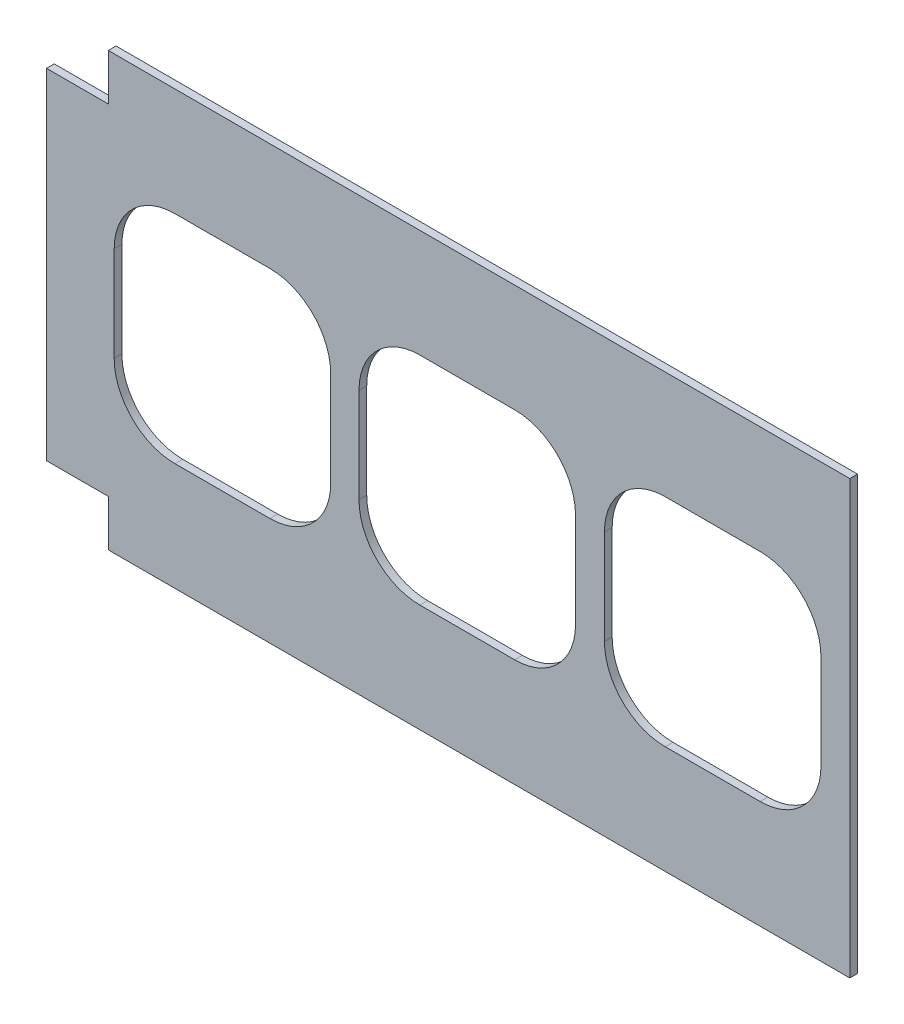
ISO-10303-21;
HEADER;
FILE_DESCRIPTION(('STEP AP214'),'2;1');
FILE_NAME('part.step','',(''),(''),'','','');
FILE_SCHEMA(('AUTOMOTIVE_DESIGN { 1 0 10303 214 1 1 1 1 }'));
ENDSEC;
DATA;
#1=APPLICATION_CONTEXT('core data for automotive mechanical design processes');
#2=APPLICATION_PROTOCOL_DEFINITION('international standard','automotive_design',2000,#1);
#3=PRODUCT_CONTEXT('',#1,'mechanical');
#4=PRODUCT('Part','Part','',(#3));
#5=PRODUCT_RELATED_PRODUCT_CATEGORY('part','',(#4));
#6=PRODUCT_DEFINITION_FORMATION('','',#4);
#7=PRODUCT_DEFINITION_CONTEXT('part definition',#1,'design');
#8=PRODUCT_DEFINITION('design','',#6,#7);
#9=PRODUCT_DEFINITION_SHAPE('','',#8);
#10=(LENGTH_UNIT() NAMED_UNIT(*) SI_UNIT(.MILLI.,.METRE.));
#11=(NAMED_UNIT(*) PLANE_ANGLE_UNIT() SI_UNIT($,.RADIAN.));
#12=(NAMED_UNIT(*) SI_UNIT($,.STERADIAN.) SOLID_ANGLE_UNIT());
#13=UNCERTAINTY_MEASURE_WITH_UNIT(LENGTH_MEASURE(1.E-05),#10,'distance_accuracy_value','');
#14=(GEOMETRIC_REPRESENTATION_CONTEXT(3) GLOBAL_UNCERTAINTY_ASSIGNED_CONTEXT((#13)) GLOBAL_UNIT_ASSIGNED_CONTEXT((#10,
#11,#12)) REPRESENTATION_CONTEXT('',''));
#15=CARTESIAN_POINT('',(0.,0.,0.));
#16=DIRECTION('',(0.,0.,1.));
#17=DIRECTION('',(1.,0.,0.));
#18=AXIS2_PLACEMENT_3D('',#15,#16,#17);
#19=CARTESIAN_POINT('',(0.,0.,3.175));
#20=DIRECTION('',(0.,0.,-1.));
#21=DIRECTION('',(-1.,0.,0.));
#22=AXIS2_PLACEMENT_3D('',#19,#20,#21);
#23=PLANE('',#22);
#24=DIRECTION('',(0.,-1.,0.));
#25=VECTOR('',#24,1.);
#26=CARTESIAN_POINT('',(-149.974,-44.5,3.175));
#27=LINE('',#26,#25);
#28=CARTESIAN_POINT('',(-149.974,19.5,3.175));
#29=VERTEX_POINT('',#28);
#30=CARTESIAN_POINT('',(-149.974,-19.5,3.175));
#31=VERTEX_POINT('',#30);
#32=EDGE_CURVE('E837',#29,#31,#27,.T.);
#33=ORIENTED_EDGE('',*,*,#32,.F.);
#34=CARTESIAN_POINT('',(-124.974,19.5,3.175));
#35=DIRECTION('',(0.,0.,-1.));
#36=DIRECTION('',(-1.,0.,0.));
#37=AXIS2_PLACEMENT_3D('',#34,#35,#36);
#38=CIRCLE('',#37,25.);
#39=CARTESIAN_POINT('',(-124.974,44.5,3.175));
#40=VERTEX_POINT('',#39);
#41=EDGE_CURVE('E333',#29,#40,#38,.T.);
#42=ORIENTED_EDGE('',*,*,#41,.T.);
#43=DIRECTION('',(-1.,0.,0.));
#44=VECTOR('',#43,1.);
#45=CARTESIAN_POINT('',(-60.974,44.5,3.175));
#46=LINE('',#45,#44);
#47=CARTESIAN_POINT('',(-85.974,44.5,3.175));
#48=VERTEX_POINT('',#47);
#49=EDGE_CURVE('E413',#48,#40,#46,.T.);
#50=ORIENTED_EDGE('',*,*,#49,.F.);
#51=CARTESIAN_POINT('',(-85.974,19.5,3.175));
#52=DIRECTION('',(0.,0.,-1.));
#53=DIRECTION('',(-1.,0.,0.));
#54=AXIS2_PLACEMENT_3D('',#51,#52,#53);
#55=CIRCLE('',#54,25.);
#56=CARTESIAN_POINT('',(-60.974,19.5,3.175));
#57=VERTEX_POINT('',#56);
#58=EDGE_CURVE('E345',#48,#57,#55,.T.);
#59=ORIENTED_EDGE('',*,*,#58,.T.);
#60=DIRECTION('',(0.,1.,0.));
#61=VECTOR('',#60,1.);
#62=CARTESIAN_POINT('',(-60.974,-44.5,3.175));
#63=LINE('',#62,#61);
#64=CARTESIAN_POINT('',(-60.974,-19.5,3.175));
#65=VERTEX_POINT('',#64);
#66=EDGE_CURVE('E843',#65,#57,#63,.T.);
#67=ORIENTED_EDGE('',*,*,#66,.F.);
#68=CARTESIAN_POINT('',(-85.974,-19.5,3.175));
#69=DIRECTION('',(0.,0.,-1.));
#70=DIRECTION('',(-1.,0.,0.));
#71=AXIS2_PLACEMENT_3D('',#68,#69,#70);
#72=CIRCLE('',#71,25.);
#73=CARTESIAN_POINT('',(-85.974,-44.5,3.175));
#74=VERTEX_POINT('',#73);
#75=EDGE_CURVE('E341',#65,#74,#72,.T.);
#76=ORIENTED_EDGE('',*,*,#75,.T.);
#77=DIRECTION('',(1.,0.,0.));
#78=VECTOR('',#77,1.);
#79=CARTESIAN_POINT('',(-60.974,-44.5,3.175));
#80=LINE('',#79,#78);
#81=CARTESIAN_POINT('',(-124.974,-44.5,3.175));
#82=VERTEX_POINT('',#81);
#83=EDGE_CURVE('E840',#82,#74,#80,.T.);
#84=ORIENTED_EDGE('',*,*,#83,.F.);
#85=CARTESIAN_POINT('',(-124.974,-19.5,3.175));
#86=DIRECTION('',(0.,0.,-1.));
#87=DIRECTION('',(-1.,0.,0.));
#88=AXIS2_PLACEMENT_3D('',#85,#86,#87);
#89=CIRCLE('',#88,25.);
#90=EDGE_CURVE('E337',#82,#31,#89,.T.);
#91=ORIENTED_EDGE('',*,*,#90,.T.);
#92=EDGE_LOOP('',(#33,#42,#50,#59,#67,#76,#84,#91));
#93=FACE_BOUND('',#92,.T.);
#94=DIRECTION('',(0.,1.,0.));
#95=VECTOR('',#94,1.);
#96=CARTESIAN_POINT('',(152.4,-88.9,3.175));
#97=LINE('',#96,#95);
#98=CARTESIAN_POINT('',(152.4,-88.9,3.175));
#99=VERTEX_POINT('',#98);
#100=CARTESIAN_POINT('',(152.4,88.9,3.175));
#101=VERTEX_POINT('',#100);
#102=EDGE_CURVE('E254',#99,#101,#97,.T.);
#103=ORIENTED_EDGE('',*,*,#102,.T.);
#104=DIRECTION('',(-1.,0.,0.));
#105=VECTOR('',#104,1.);
#106=CARTESIAN_POINT('',(-152.4,88.9,3.175));
#107=LINE('',#106,#105);
#108=CARTESIAN_POINT('',(-152.4,88.9,3.175));
#109=VERTEX_POINT('',#108);
#110=EDGE_CURVE('E243',#101,#109,#107,.T.);
#111=ORIENTED_EDGE('',*,*,#110,.T.);
#112=DIRECTION('',(0.,-1.,0.));
#113=VECTOR('',#112,1.);
#114=CARTESIAN_POINT('',(-152.4,69.85,3.175));
#115=LINE('',#114,#113);
#116=CARTESIAN_POINT('',(-152.4,69.85,3.175));
#117=VERTEX_POINT('',#116);
#118=EDGE_CURVE('E253',#109,#117,#115,.T.);
#119=ORIENTED_EDGE('',*,*,#118,.T.);
#120=DIRECTION('',(-1.,0.,0.));
#121=VECTOR('',#120,1.);
#122=CARTESIAN_POINT('',(-152.4,69.85,3.175));
#123=LINE('',#122,#121);
#124=CARTESIAN_POINT('',(-177.8,69.85,3.175));
#125=VERTEX_POINT('',#124);
#126=EDGE_CURVE('E417',#117,#125,#123,.T.);
#127=ORIENTED_EDGE('',*,*,#126,.T.);
#128=DIRECTION('',(0.,-1.,0.));
#129=VECTOR('',#128,1.);
#130=CARTESIAN_POINT('',(-177.8,69.85,3.175));
#131=LINE('',#130,#129);
#132=CARTESIAN_POINT('',(-177.8,-69.85,3.175));
#133=VERTEX_POINT('',#132);
#134=EDGE_CURVE('E419',#125,#133,#131,.T.);
#135=ORIENTED_EDGE('',*,*,#134,.T.);
#136=DIRECTION('',(1.,0.,0.));
#137=VECTOR('',#136,1.);
#138=CARTESIAN_POINT('',(-177.8,-69.85,3.175));
#139=LINE('',#138,#137);
#140=CARTESIAN_POINT('',(-152.4,-69.85,3.175));
#141=VERTEX_POINT('',#140);
#142=EDGE_CURVE('E421',#133,#141,#139,.T.);
#143=ORIENTED_EDGE('',*,*,#142,.T.);
#144=DIRECTION('',(0.,-1.,0.));
#145=VECTOR('',#144,1.);
#146=CARTESIAN_POINT('',(-152.4,-88.9,3.175));
#147=LINE('',#146,#145);
#148=CARTESIAN_POINT('',(-152.4,-88.9,3.175));
#149=VERTEX_POINT('',#148);
#150=EDGE_CURVE('E423',#141,#149,#147,.T.);
#151=ORIENTED_EDGE('',*,*,#150,.T.);
#152=DIRECTION('',(1.,0.,0.));
#153=VECTOR('',#152,1.);
#154=CARTESIAN_POINT('',(-152.4,-88.9,3.175));
#155=LINE('',#154,#153);
#156=EDGE_CURVE('E258',#149,#99,#155,.T.);
#157=ORIENTED_EDGE('',*,*,#156,.T.);
#158=EDGE_LOOP('',(#103,#111,#119,#127,#135,#143,#151,#157));
#159=FACE_BOUND('',#158,.T.);
#160=DIRECTION('',(0.,1.,0.));
#161=VECTOR('',#160,1.);
#162=CARTESIAN_POINT('',(140.55,-44.5,3.175));
#163=LINE('',#162,#161);
#164=CARTESIAN_POINT('',(140.55,-19.5,3.175));
#165=VERTEX_POINT('',#164);
#166=CARTESIAN_POINT('',(140.55,19.5,3.175));
#167=VERTEX_POINT('',#166);
#168=EDGE_CURVE('E392',#165,#167,#163,.T.);
#169=ORIENTED_EDGE('',*,*,#168,.F.);
#170=CARTESIAN_POINT('',(115.55,-19.5,3.175));
#171=DIRECTION('',(0.,0.,-1.));
#172=DIRECTION('',(-1.,0.,0.));
#173=AXIS2_PLACEMENT_3D('',#170,#171,#172);
#174=CIRCLE('',#173,25.);
#175=CARTESIAN_POINT('',(115.55,-44.5,3.175));
#176=VERTEX_POINT('',#175);
#177=EDGE_CURVE('E365',#165,#176,#174,.T.);
#178=ORIENTED_EDGE('',*,*,#177,.T.);
#179=DIRECTION('',(1.,0.,0.));
#180=VECTOR('',#179,1.);
#181=CARTESIAN_POINT('',(51.55,-44.5,3.175));
#182=LINE('',#181,#180);
#183=CARTESIAN_POINT('',(76.55,-44.5,3.175));
#184=VERTEX_POINT('',#183);
#185=EDGE_CURVE('E410',#184,#176,#182,.T.);
#186=ORIENTED_EDGE('',*,*,#185,.F.);
#187=CARTESIAN_POINT('',(76.55,-19.5,3.175));
#188=DIRECTION('',(0.,0.,-1.));
#189=DIRECTION('',(-1.,0.,0.));
#190=AXIS2_PLACEMENT_3D('',#187,#188,#189);
#191=CIRCLE('',#190,25.);
#192=CARTESIAN_POINT('',(51.55,-19.5,3.175));
#193=VERTEX_POINT('',#192);
#194=EDGE_CURVE('E369',#184,#193,#191,.T.);
#195=ORIENTED_EDGE('',*,*,#194,.T.);
#196=DIRECTION('',(0.,-1.,0.));
#197=VECTOR('',#196,1.);
#198=CARTESIAN_POINT('',(51.55,-44.5,3.175));
#199=LINE('',#198,#197);
#200=CARTESIAN_POINT('',(51.55,19.5,3.175));
#201=VERTEX_POINT('',#200);
#202=EDGE_CURVE('E400',#201,#193,#199,.T.);
#203=ORIENTED_EDGE('',*,*,#202,.F.);
#204=CARTESIAN_POINT('',(76.55,19.5,3.175));
#205=DIRECTION('',(0.,0.,-1.));
#206=DIRECTION('',(-1.,0.,0.));
#207=AXIS2_PLACEMENT_3D('',#204,#205,#206);
#208=CIRCLE('',#207,25.);
#209=CARTESIAN_POINT('',(76.55,44.5,3.175));
#210=VERTEX_POINT('',#209);
#211=EDGE_CURVE('E48',#201,#210,#208,.T.);
#212=ORIENTED_EDGE('',*,*,#211,.T.);
#213=DIRECTION('',(-1.,0.,0.));
#214=VECTOR('',#213,1.);
#215=CARTESIAN_POINT('',(51.55,44.5,3.175));
#216=LINE('',#215,#214);
#217=CARTESIAN_POINT('',(115.55,44.5,3.175));
#218=VERTEX_POINT('',#217);
#219=EDGE_CURVE('E394',#218,#210,#216,.T.);
#220=ORIENTED_EDGE('',*,*,#219,.F.);
#221=CARTESIAN_POINT('',(115.55,19.5,3.175));
#222=DIRECTION('',(0.,0.,-1.));
#223=DIRECTION('',(-1.,0.,0.));
#224=AXIS2_PLACEMENT_3D('',#221,#222,#223);
#225=CIRCLE('',#224,25.);
#226=EDGE_CURVE('E11',#218,#167,#225,.T.);
#227=ORIENTED_EDGE('',*,*,#226,.T.);
#228=EDGE_LOOP('',(#169,#178,#186,#195,#203,#212,#220,#227));
#229=FACE_BOUND('',#228,.T.);
#230=DIRECTION('',(0.,-1.,0.));
#231=VECTOR('',#230,1.);
#232=CARTESIAN_POINT('',(-49.339,-44.5,3.175));
#233=LINE('',#232,#231);
#234=CARTESIAN_POINT('',(-49.339,19.5,3.175));
#235=VERTEX_POINT('',#234);
#236=CARTESIAN_POINT('',(-49.339,-19.5,3.175));
#237=VERTEX_POINT('',#236);
#238=EDGE_CURVE('E809',#235,#237,#233,.T.);
#239=ORIENTED_EDGE('',*,*,#238,.F.);
#240=CARTESIAN_POINT('',(-24.339,19.5,3.175));
#241=DIRECTION('',(0.,0.,-1.));
#242=DIRECTION('',(-1.,0.,0.));
#243=AXIS2_PLACEMENT_3D('',#240,#241,#242);
#244=CIRCLE('',#243,25.);
#245=CARTESIAN_POINT('',(-24.339,44.5,3.175));
#246=VERTEX_POINT('',#245);
#247=EDGE_CURVE('E349',#235,#246,#244,.T.);
#248=ORIENTED_EDGE('',*,*,#247,.T.);
#249=DIRECTION('',(-1.,0.,0.));
#250=VECTOR('',#249,1.);
#251=CARTESIAN_POINT('',(39.661,44.5,3.175));
#252=LINE('',#251,#250);
#253=CARTESIAN_POINT('',(14.661,44.5,3.175));
#254=VERTEX_POINT('',#253);
#255=EDGE_CURVE('E826',#254,#246,#252,.T.);
#256=ORIENTED_EDGE('',*,*,#255,.F.);
#257=CARTESIAN_POINT('',(14.661,19.5,3.175));
#258=DIRECTION('',(0.,0.,-1.));
#259=DIRECTION('',(-1.,0.,0.));
#260=AXIS2_PLACEMENT_3D('',#257,#258,#259);
#261=CIRCLE('',#260,25.);
#262=CARTESIAN_POINT('',(39.661,19.5,3.175));
#263=VERTEX_POINT('',#262);
#264=EDGE_CURVE('E353',#254,#263,#261,.T.);
#265=ORIENTED_EDGE('',*,*,#264,.T.);
#266=DIRECTION('',(0.,1.,0.));
#267=VECTOR('',#266,1.);
#268=CARTESIAN_POINT('',(39.661,-44.5,3.175));
#269=LINE('',#268,#267);
#270=CARTESIAN_POINT('',(39.661,-19.5,3.175));
#271=VERTEX_POINT('',#270);
#272=EDGE_CURVE('E818',#271,#263,#269,.T.);
#273=ORIENTED_EDGE('',*,*,#272,.F.);
#274=CARTESIAN_POINT('',(14.661,-19.5,3.175));
#275=DIRECTION('',(0.,0.,-1.));
#276=DIRECTION('',(-1.,0.,0.));
#277=AXIS2_PLACEMENT_3D('',#274,#275,#276);
#278=CIRCLE('',#277,25.);
#279=CARTESIAN_POINT('',(14.661,-44.5,3.175));
#280=VERTEX_POINT('',#279);
#281=EDGE_CURVE('E357',#271,#280,#278,.T.);
#282=ORIENTED_EDGE('',*,*,#281,.T.);
#283=DIRECTION('',(1.,0.,0.));
#284=VECTOR('',#283,1.);
#285=CARTESIAN_POINT('',(39.661,-44.5,3.175));
#286=LINE('',#285,#284);
#287=CARTESIAN_POINT('',(-24.339,-44.5,3.175));
#288=VERTEX_POINT('',#287);
#289=EDGE_CURVE('E812',#288,#280,#286,.T.);
#290=ORIENTED_EDGE('',*,*,#289,.F.);
#291=CARTESIAN_POINT('',(-24.339,-19.5,3.175));
#292=DIRECTION('',(0.,0.,-1.));
#293=DIRECTION('',(-1.,0.,0.));
#294=AXIS2_PLACEMENT_3D('',#291,#292,#293);
#295=CIRCLE('',#294,25.);
#296=EDGE_CURVE('E361',#288,#237,#295,.T.);
#297=ORIENTED_EDGE('',*,*,#296,.T.);
#298=EDGE_LOOP('',(#239,#248,#256,#265,#273,#282,#290,#297));
#299=FACE_BOUND('',#298,.T.);
#300=ADVANCED_FACE('F33',(#93,#159,#229,#299),#23,.F.);
#301=CARTESIAN_POINT('',(0.,0.,0.));
#302=DIRECTION('',(0.,0.,-1.));
#303=DIRECTION('',(-1.,0.,0.));
#304=AXIS2_PLACEMENT_3D('',#301,#302,#303);
#305=PLANE('',#304);
#306=DIRECTION('',(0.,1.,0.));
#307=VECTOR('',#306,1.);
#308=CARTESIAN_POINT('',(152.4,-88.9,0.));
#309=LINE('',#308,#307);
#310=CARTESIAN_POINT('',(152.4,-88.9,0.));
#311=VERTEX_POINT('',#310);
#312=CARTESIAN_POINT('',(152.4,88.9,0.));
#313=VERTEX_POINT('',#312);
#314=EDGE_CURVE('E266',#311,#313,#309,.T.);
#315=ORIENTED_EDGE('',*,*,#314,.F.);
#316=DIRECTION('',(1.,0.,0.));
#317=VECTOR('',#316,1.);
#318=CARTESIAN_POINT('',(-152.4,-88.9,0.));
#319=LINE('',#318,#317);
#320=CARTESIAN_POINT('',(-152.4,-88.9,0.));
#321=VERTEX_POINT('',#320);
#322=EDGE_CURVE('E262',#321,#311,#319,.T.);
#323=ORIENTED_EDGE('',*,*,#322,.F.);
#324=DIRECTION('',(0.,-1.,0.));
#325=VECTOR('',#324,1.);
#326=CARTESIAN_POINT('',(-152.4,-88.9,0.));
#327=LINE('',#326,#325);
#328=CARTESIAN_POINT('',(-152.4,-69.85,0.));
#329=VERTEX_POINT('',#328);
#330=EDGE_CURVE('E438',#329,#321,#327,.T.);
#331=ORIENTED_EDGE('',*,*,#330,.F.);
#332=DIRECTION('',(1.,0.,0.));
#333=VECTOR('',#332,1.);
#334=CARTESIAN_POINT('',(-177.8,-69.85,0.));
#335=LINE('',#334,#333);
#336=CARTESIAN_POINT('',(-177.8,-69.85,0.));
#337=VERTEX_POINT('',#336);
#338=EDGE_CURVE('E436',#337,#329,#335,.T.);
#339=ORIENTED_EDGE('',*,*,#338,.F.);
#340=DIRECTION('',(0.,-1.,0.));
#341=VECTOR('',#340,1.);
#342=CARTESIAN_POINT('',(-177.8,69.85,0.));
#343=LINE('',#342,#341);
#344=CARTESIAN_POINT('',(-177.8,69.85,0.));
#345=VERTEX_POINT('',#344);
#346=EDGE_CURVE('E434',#345,#337,#343,.T.);
#347=ORIENTED_EDGE('',*,*,#346,.F.);
#348=DIRECTION('',(-1.,0.,0.));
#349=VECTOR('',#348,1.);
#350=CARTESIAN_POINT('',(-152.4,69.85,0.));
#351=LINE('',#350,#349);
#352=CARTESIAN_POINT('',(-152.4,69.85,0.));
#353=VERTEX_POINT('',#352);
#354=EDGE_CURVE('E432',#353,#345,#351,.T.);
#355=ORIENTED_EDGE('',*,*,#354,.F.);
#356=DIRECTION('',(0.,-1.,0.));
#357=VECTOR('',#356,1.);
#358=CARTESIAN_POINT('',(-152.4,69.85,0.));
#359=LINE('',#358,#357);
#360=CARTESIAN_POINT('',(-152.4,88.9,0.));
#361=VERTEX_POINT('',#360);
#362=EDGE_CURVE('E430',#361,#353,#359,.T.);
#363=ORIENTED_EDGE('',*,*,#362,.F.);
#364=DIRECTION('',(-1.,0.,0.));
#365=VECTOR('',#364,1.);
#366=CARTESIAN_POINT('',(-152.4,88.9,0.));
#367=LINE('',#366,#365);
#368=EDGE_CURVE('E428',#313,#361,#367,.T.);
#369=ORIENTED_EDGE('',*,*,#368,.F.);
#370=EDGE_LOOP('',(#315,#323,#331,#339,#347,#355,#363,#369));
#371=FACE_BOUND('',#370,.T.);
#372=DIRECTION('',(0.,-1.,0.));
#373=VECTOR('',#372,1.);
#374=CARTESIAN_POINT('',(51.55,-44.5,0.));
#375=LINE('',#374,#373);
#376=CARTESIAN_POINT('',(51.55,19.5,0.));
#377=VERTEX_POINT('',#376);
#378=CARTESIAN_POINT('',(51.55,-19.5,0.));
#379=VERTEX_POINT('',#378);
#380=EDGE_CURVE('E386',#377,#379,#375,.T.);
#381=ORIENTED_EDGE('',*,*,#380,.T.);
#382=CARTESIAN_POINT('',(76.55,-19.5,0.));
#383=DIRECTION('',(0.,0.,-1.));
#384=DIRECTION('',(-1.,0.,0.));
#385=AXIS2_PLACEMENT_3D('',#382,#383,#384);
#386=CIRCLE('',#385,25.);
#387=CARTESIAN_POINT('',(76.55,-44.5,0.));
#388=VERTEX_POINT('',#387);
#389=EDGE_CURVE('E367',#379,#388,#386,.F.);
#390=ORIENTED_EDGE('',*,*,#389,.T.);
#391=DIRECTION('',(1.,0.,0.));
#392=VECTOR('',#391,1.);
#393=CARTESIAN_POINT('',(51.55,-44.5,0.));
#394=LINE('',#393,#392);
#395=CARTESIAN_POINT('',(115.55,-44.5,0.));
#396=VERTEX_POINT('',#395);
#397=EDGE_CURVE('E398',#388,#396,#394,.T.);
#398=ORIENTED_EDGE('',*,*,#397,.T.);
#399=CARTESIAN_POINT('',(115.55,-19.5,0.));
#400=DIRECTION('',(0.,0.,-1.));
#401=DIRECTION('',(-1.,0.,0.));
#402=AXIS2_PLACEMENT_3D('',#399,#400,#401);
#403=CIRCLE('',#402,25.);
#404=CARTESIAN_POINT('',(140.55,-19.5,0.));
#405=VERTEX_POINT('',#404);
#406=EDGE_CURVE('E363',#396,#405,#403,.F.);
#407=ORIENTED_EDGE('',*,*,#406,.T.);
#408=DIRECTION('',(0.,1.,0.));
#409=VECTOR('',#408,1.);
#410=CARTESIAN_POINT('',(140.55,-44.5,0.));
#411=LINE('',#410,#409);
#412=CARTESIAN_POINT('',(140.55,19.5,0.));
#413=VERTEX_POINT('',#412);
#414=EDGE_CURVE('E381',#405,#413,#411,.T.);
#415=ORIENTED_EDGE('',*,*,#414,.T.);
#416=CARTESIAN_POINT('',(115.55,19.5,0.));
#417=DIRECTION('',(0.,0.,-1.));
#418=DIRECTION('',(-1.,0.,0.));
#419=AXIS2_PLACEMENT_3D('',#416,#417,#418);
#420=CIRCLE('',#419,25.);
#421=CARTESIAN_POINT('',(115.55,44.5,0.));
#422=VERTEX_POINT('',#421);
#423=EDGE_CURVE('E41',#413,#422,#420,.F.);
#424=ORIENTED_EDGE('',*,*,#423,.T.);
#425=DIRECTION('',(-1.,0.,0.));
#426=VECTOR('',#425,1.);
#427=CARTESIAN_POINT('',(51.55,44.5,0.));
#428=LINE('',#427,#426);
#429=CARTESIAN_POINT('',(76.55,44.5,0.));
#430=VERTEX_POINT('',#429);
#431=EDGE_CURVE('E379',#422,#430,#428,.T.);
#432=ORIENTED_EDGE('',*,*,#431,.T.);
#433=CARTESIAN_POINT('',(76.55,19.5,0.));
#434=DIRECTION('',(0.,0.,-1.));
#435=DIRECTION('',(-1.,0.,0.));
#436=AXIS2_PLACEMENT_3D('',#433,#434,#435);
#437=CIRCLE('',#436,25.);
#438=EDGE_CURVE('E371',#430,#377,#437,.F.);
#439=ORIENTED_EDGE('',*,*,#438,.T.);
#440=EDGE_LOOP('',(#381,#390,#398,#407,#415,#424,#432,#439));
#441=FACE_BOUND('',#440,.T.);
#442=DIRECTION('',(0.,1.,0.));
#443=VECTOR('',#442,1.);
#444=CARTESIAN_POINT('',(-60.974,-44.5,0.));
#445=LINE('',#444,#443);
#446=CARTESIAN_POINT('',(-60.974,-19.5,0.));
#447=VERTEX_POINT('',#446);
#448=CARTESIAN_POINT('',(-60.974,19.5,0.));
#449=VERTEX_POINT('',#448);
#450=EDGE_CURVE('E852',#447,#449,#445,.T.);
#451=ORIENTED_EDGE('',*,*,#450,.T.);
#452=CARTESIAN_POINT('',(-85.974,19.5,0.));
#453=DIRECTION('',(0.,0.,-1.));
#454=DIRECTION('',(-1.,0.,0.));
#455=AXIS2_PLACEMENT_3D('',#452,#453,#454);
#456=CIRCLE('',#455,25.);
#457=CARTESIAN_POINT('',(-85.974,44.5,0.));
#458=VERTEX_POINT('',#457);
#459=EDGE_CURVE('E343',#449,#458,#456,.F.);
#460=ORIENTED_EDGE('',*,*,#459,.T.);
#461=DIRECTION('',(-1.,0.,0.));
#462=VECTOR('',#461,1.);
#463=CARTESIAN_POINT('',(-60.974,44.5,0.));
#464=LINE('',#463,#462);
#465=CARTESIAN_POINT('',(-124.974,44.5,0.));
#466=VERTEX_POINT('',#465);
#467=EDGE_CURVE('E405',#458,#466,#464,.T.);
#468=ORIENTED_EDGE('',*,*,#467,.T.);
#469=CARTESIAN_POINT('',(-124.974,19.5,0.));
#470=DIRECTION('',(0.,0.,-1.));
#471=DIRECTION('',(-1.,0.,0.));
#472=AXIS2_PLACEMENT_3D('',#469,#470,#471);
#473=CIRCLE('',#472,25.);
#474=CARTESIAN_POINT('',(-149.974,19.5,0.));
#475=VERTEX_POINT('',#474);
#476=EDGE_CURVE('E331',#466,#475,#473,.F.);
#477=ORIENTED_EDGE('',*,*,#476,.T.);
#478=DIRECTION('',(0.,-1.,0.));
#479=VECTOR('',#478,1.);
#480=CARTESIAN_POINT('',(-149.974,-44.5,0.));
#481=LINE('',#480,#479);
#482=CARTESIAN_POINT('',(-149.974,-19.5,0.));
#483=VERTEX_POINT('',#482);
#484=EDGE_CURVE('E829',#475,#483,#481,.T.);
#485=ORIENTED_EDGE('',*,*,#484,.T.);
#486=CARTESIAN_POINT('',(-124.974,-19.5,0.));
#487=DIRECTION('',(0.,0.,-1.));
#488=DIRECTION('',(-1.,0.,0.));
#489=AXIS2_PLACEMENT_3D('',#486,#487,#488);
#490=CIRCLE('',#489,25.);
#491=CARTESIAN_POINT('',(-124.974,-44.5,0.));
#492=VERTEX_POINT('',#491);
#493=EDGE_CURVE('E335',#483,#492,#490,.F.);
#494=ORIENTED_EDGE('',*,*,#493,.T.);
#495=DIRECTION('',(1.,0.,0.));
#496=VECTOR('',#495,1.);
#497=CARTESIAN_POINT('',(-60.974,-44.5,0.));
#498=LINE('',#497,#496);
#499=CARTESIAN_POINT('',(-85.974,-44.5,0.));
#500=VERTEX_POINT('',#499);
#501=EDGE_CURVE('E850',#492,#500,#498,.T.);
#502=ORIENTED_EDGE('',*,*,#501,.T.);
#503=CARTESIAN_POINT('',(-85.974,-19.5,0.));
#504=DIRECTION('',(0.,0.,-1.));
#505=DIRECTION('',(-1.,0.,0.));
#506=AXIS2_PLACEMENT_3D('',#503,#504,#505);
#507=CIRCLE('',#506,25.);
#508=EDGE_CURVE('E339',#500,#447,#507,.F.);
#509=ORIENTED_EDGE('',*,*,#508,.T.);
#510=EDGE_LOOP('',(#451,#460,#468,#477,#485,#494,#502,#509));
#511=FACE_BOUND('',#510,.T.);
#512=DIRECTION('',(0.,1.,0.));
#513=VECTOR('',#512,1.);
#514=CARTESIAN_POINT('',(39.661,-44.5,0.));
#515=LINE('',#514,#513);
#516=CARTESIAN_POINT('',(39.661,-19.5,0.));
#517=VERTEX_POINT('',#516);
#518=CARTESIAN_POINT('',(39.661,19.5,0.));
#519=VERTEX_POINT('',#518);
#520=EDGE_CURVE('E821',#517,#519,#515,.T.);
#521=ORIENTED_EDGE('',*,*,#520,.T.);
#522=CARTESIAN_POINT('',(14.661,19.5,0.));
#523=DIRECTION('',(0.,0.,-1.));
#524=DIRECTION('',(-1.,0.,0.));
#525=AXIS2_PLACEMENT_3D('',#522,#523,#524);
#526=CIRCLE('',#525,25.);
#527=CARTESIAN_POINT('',(14.661,44.5,0.));
#528=VERTEX_POINT('',#527);
#529=EDGE_CURVE('E351',#519,#528,#526,.F.);
#530=ORIENTED_EDGE('',*,*,#529,.T.);
#531=DIRECTION('',(-1.,0.,0.));
#532=VECTOR('',#531,1.);
#533=CARTESIAN_POINT('',(39.661,44.5,0.));
#534=LINE('',#533,#532);
#535=CARTESIAN_POINT('',(-24.339,44.5,0.));
#536=VERTEX_POINT('',#535);
#537=EDGE_CURVE('E816',#528,#536,#534,.T.);
#538=ORIENTED_EDGE('',*,*,#537,.T.);
#539=CARTESIAN_POINT('',(-24.339,19.5,0.));
#540=DIRECTION('',(0.,0.,-1.));
#541=DIRECTION('',(-1.,0.,0.));
#542=AXIS2_PLACEMENT_3D('',#539,#540,#541);
#543=CIRCLE('',#542,25.);
#544=CARTESIAN_POINT('',(-49.339,19.5,0.));
#545=VERTEX_POINT('',#544);
#546=EDGE_CURVE('E347',#536,#545,#543,.F.);
#547=ORIENTED_EDGE('',*,*,#546,.T.);
#548=DIRECTION('',(0.,-1.,0.));
#549=VECTOR('',#548,1.);
#550=CARTESIAN_POINT('',(-49.339,-44.5,0.));
#551=LINE('',#550,#549);
#552=CARTESIAN_POINT('',(-49.339,-19.5,0.));
#553=VERTEX_POINT('',#552);
#554=EDGE_CURVE('E830',#545,#553,#551,.T.);
#555=ORIENTED_EDGE('',*,*,#554,.T.);
#556=CARTESIAN_POINT('',(-24.339,-19.5,0.));
#557=DIRECTION('',(0.,0.,-1.));
#558=DIRECTION('',(-1.,0.,0.));
#559=AXIS2_PLACEMENT_3D('',#556,#557,#558);
#560=CIRCLE('',#559,25.);
#561=CARTESIAN_POINT('',(-24.339,-44.5,0.));
#562=VERTEX_POINT('',#561);
#563=EDGE_CURVE('E359',#553,#562,#560,.F.);
#564=ORIENTED_EDGE('',*,*,#563,.T.);
#565=DIRECTION('',(1.,0.,0.));
#566=VECTOR('',#565,1.);
#567=CARTESIAN_POINT('',(39.661,-44.5,0.));
#568=LINE('',#567,#566);
#569=CARTESIAN_POINT('',(14.661,-44.5,0.));
#570=VERTEX_POINT('',#569);
#571=EDGE_CURVE('E832',#562,#570,#568,.T.);
#572=ORIENTED_EDGE('',*,*,#571,.T.);
#573=CARTESIAN_POINT('',(14.661,-19.5,0.));
#574=DIRECTION('',(0.,0.,-1.));
#575=DIRECTION('',(-1.,0.,0.));
#576=AXIS2_PLACEMENT_3D('',#573,#574,#575);
#577=CIRCLE('',#576,25.);
#578=EDGE_CURVE('E355',#570,#517,#577,.F.);
#579=ORIENTED_EDGE('',*,*,#578,.T.);
#580=EDGE_LOOP('',(#521,#530,#538,#547,#555,#564,#572,#579));
#581=FACE_BOUND('',#580,.T.);
#582=ADVANCED_FACE('F377',(#371,#441,#511,#581),#305,.T.);
#583=CARTESIAN_POINT('',(152.4,-88.9,3.175));
#584=DIRECTION('',(-1.,0.,0.));
#585=DIRECTION('',(0.,0.,1.));
#586=AXIS2_PLACEMENT_3D('',#583,#584,#585);
#587=PLANE('',#586);
#588=ORIENTED_EDGE('',*,*,#314,.T.);
#589=DIRECTION('',(0.,0.,-1.));
#590=VECTOR('',#589,1.);
#591=CARTESIAN_POINT('',(152.4,88.9,3.175));
#592=LINE('',#591,#590);
#593=EDGE_CURVE('E247',#101,#313,#592,.T.);
#594=ORIENTED_EDGE('',*,*,#593,.F.);
#595=ORIENTED_EDGE('',*,*,#102,.F.);
#596=DIRECTION('',(0.,0.,-1.));
#597=VECTOR('',#596,1.);
#598=CARTESIAN_POINT('',(152.4,-88.9,3.175));
#599=LINE('',#598,#597);
#600=EDGE_CURVE('E426',#99,#311,#599,.T.);
#601=ORIENTED_EDGE('',*,*,#600,.T.);
#602=EDGE_LOOP('',(#588,#594,#595,#601));
#603=FACE_BOUND('',#602,.T.);
#604=ADVANCED_FACE('F264',(#603),#587,.F.);
#605=CARTESIAN_POINT('',(-152.4,88.9,3.175));
#606=DIRECTION('',(0.,-1.,0.));
#607=DIRECTION('',(0.,0.,-1.));
#608=AXIS2_PLACEMENT_3D('',#605,#606,#607);
#609=PLANE('',#608);
#610=ORIENTED_EDGE('',*,*,#368,.T.);
#611=DIRECTION('',(0.,0.,-1.));
#612=VECTOR('',#611,1.);
#613=CARTESIAN_POINT('',(-152.4,88.9,3.175));
#614=LINE('',#613,#612);
#615=EDGE_CURVE('E250',#109,#361,#614,.T.);
#616=ORIENTED_EDGE('',*,*,#615,.F.);
#617=ORIENTED_EDGE('',*,*,#110,.F.);
#618=ORIENTED_EDGE('',*,*,#593,.T.);
#619=EDGE_LOOP('',(#610,#616,#617,#618));
#620=FACE_BOUND('',#619,.T.);
#621=ADVANCED_FACE('F245',(#620),#609,.F.);
#622=CARTESIAN_POINT('',(-152.4,69.85,3.175));
#623=DIRECTION('',(1.,0.,0.));
#624=DIRECTION('',(0.,0.,-1.));
#625=AXIS2_PLACEMENT_3D('',#622,#623,#624);
#626=PLANE('',#625);
#627=ORIENTED_EDGE('',*,*,#362,.T.);
#628=DIRECTION('',(0.,0.,-1.));
#629=VECTOR('',#628,1.);
#630=CARTESIAN_POINT('',(-152.4,69.85,3.175));
#631=LINE('',#630,#629);
#632=EDGE_CURVE('E271',#117,#353,#631,.T.);
#633=ORIENTED_EDGE('',*,*,#632,.F.);
#634=ORIENTED_EDGE('',*,*,#118,.F.);
#635=ORIENTED_EDGE('',*,*,#615,.T.);
#636=EDGE_LOOP('',(#627,#633,#634,#635));
#637=FACE_BOUND('',#636,.T.);
#638=ADVANCED_FACE('F476',(#637),#626,.F.);
#639=CARTESIAN_POINT('',(-152.4,69.85,3.175));
#640=DIRECTION('',(0.,-1.,0.));
#641=DIRECTION('',(0.,0.,-1.));
#642=AXIS2_PLACEMENT_3D('',#639,#640,#641);
#643=PLANE('',#642);
#644=ORIENTED_EDGE('',*,*,#354,.T.);
#645=DIRECTION('',(0.,0.,-1.));
#646=VECTOR('',#645,1.);
#647=CARTESIAN_POINT('',(-177.8,69.85,3.175));
#648=LINE('',#647,#646);
#649=EDGE_CURVE('E451',#125,#345,#648,.T.);
#650=ORIENTED_EDGE('',*,*,#649,.F.);
#651=ORIENTED_EDGE('',*,*,#126,.F.);
#652=ORIENTED_EDGE('',*,*,#632,.T.);
#653=EDGE_LOOP('',(#644,#650,#651,#652));
#654=FACE_BOUND('',#653,.T.);
#655=ADVANCED_FACE('F458',(#654),#643,.F.);
#656=CARTESIAN_POINT('',(-177.8,69.85,3.175));
#657=DIRECTION('',(1.,0.,0.));
#658=DIRECTION('',(0.,0.,-1.));
#659=AXIS2_PLACEMENT_3D('',#656,#657,#658);
#660=PLANE('',#659);
#661=ORIENTED_EDGE('',*,*,#346,.T.);
#662=DIRECTION('',(0.,0.,-1.));
#663=VECTOR('',#662,1.);
#664=CARTESIAN_POINT('',(-177.8,-69.85,3.175));
#665=LINE('',#664,#663);
#666=EDGE_CURVE('E448',#133,#337,#665,.T.);
#667=ORIENTED_EDGE('',*,*,#666,.F.);
#668=ORIENTED_EDGE('',*,*,#134,.F.);
#669=ORIENTED_EDGE('',*,*,#649,.T.);
#670=EDGE_LOOP('',(#661,#667,#668,#669));
#671=FACE_BOUND('',#670,.T.);
#672=ADVANCED_FACE('F468',(#671),#660,.F.);
#673=CARTESIAN_POINT('',(-177.8,-69.85,3.175));
#674=DIRECTION('',(0.,1.,0.));
#675=DIRECTION('',(0.,0.,1.));
#676=AXIS2_PLACEMENT_3D('',#673,#674,#675);
#677=PLANE('',#676);
#678=ORIENTED_EDGE('',*,*,#338,.T.);
#679=DIRECTION('',(0.,0.,-1.));
#680=VECTOR('',#679,1.);
#681=CARTESIAN_POINT('',(-152.4,-69.85,3.175));
#682=LINE('',#681,#680);
#683=EDGE_CURVE('E445',#141,#329,#682,.T.);
#684=ORIENTED_EDGE('',*,*,#683,.F.);
#685=ORIENTED_EDGE('',*,*,#142,.F.);
#686=ORIENTED_EDGE('',*,*,#666,.T.);
#687=EDGE_LOOP('',(#678,#684,#685,#686));
#688=FACE_BOUND('',#687,.T.);
#689=ADVANCED_FACE('F472',(#688),#677,.F.);
#690=CARTESIAN_POINT('',(-152.4,-88.9,3.175));
#691=DIRECTION('',(1.,0.,0.));
#692=DIRECTION('',(0.,0.,-1.));
#693=AXIS2_PLACEMENT_3D('',#690,#691,#692);
#694=PLANE('',#693);
#695=ORIENTED_EDGE('',*,*,#330,.T.);
#696=DIRECTION('',(0.,0.,-1.));
#697=VECTOR('',#696,1.);
#698=CARTESIAN_POINT('',(-152.4,-88.9,3.175));
#699=LINE('',#698,#697);
#700=EDGE_CURVE('E442',#149,#321,#699,.T.);
#701=ORIENTED_EDGE('',*,*,#700,.F.);
#702=ORIENTED_EDGE('',*,*,#150,.F.);
#703=ORIENTED_EDGE('',*,*,#683,.T.);
#704=EDGE_LOOP('',(#695,#701,#702,#703));
#705=FACE_BOUND('',#704,.T.);
#706=ADVANCED_FACE('F499',(#705),#694,.F.);
#707=CARTESIAN_POINT('',(-152.4,-88.9,3.175));
#708=DIRECTION('',(0.,1.,0.));
#709=DIRECTION('',(0.,0.,1.));
#710=AXIS2_PLACEMENT_3D('',#707,#708,#709);
#711=PLANE('',#710);
#712=ORIENTED_EDGE('',*,*,#322,.T.);
#713=ORIENTED_EDGE('',*,*,#600,.F.);
#714=ORIENTED_EDGE('',*,*,#156,.F.);
#715=ORIENTED_EDGE('',*,*,#700,.T.);
#716=EDGE_LOOP('',(#712,#713,#714,#715));
#717=FACE_BOUND('',#716,.T.);
#718=ADVANCED_FACE('F496',(#717),#711,.F.);
#719=CARTESIAN_POINT('',(140.55,-44.5,3.175));
#720=DIRECTION('',(-1.,0.,0.));
#721=DIRECTION('',(0.,0.,1.));
#722=AXIS2_PLACEMENT_3D('',#719,#720,#721);
#723=PLANE('',#722);
#724=ORIENTED_EDGE('',*,*,#414,.F.);
#725=DIRECTION('',(0.,0.,-1.));
#726=VECTOR('',#725,1.);
#727=CARTESIAN_POINT('',(140.55,-19.5,3.175));
#728=LINE('',#727,#726);
#729=EDGE_CURVE('E320',#405,#165,#728,.F.);
#730=ORIENTED_EDGE('',*,*,#729,.T.);
#731=ORIENTED_EDGE('',*,*,#168,.T.);
#732=DIRECTION('',(0.,0.,-1.));
#733=VECTOR('',#732,1.);
#734=CARTESIAN_POINT('',(140.55,19.5,0.));
#735=LINE('',#734,#733);
#736=EDGE_CURVE('E317',#167,#413,#735,.T.);
#737=ORIENTED_EDGE('',*,*,#736,.T.);
#738=EDGE_LOOP('',(#724,#730,#731,#737));
#739=FACE_BOUND('',#738,.T.);
#740=ADVANCED_FACE('F396',(#739),#723,.T.);
#741=CARTESIAN_POINT('',(51.55,44.5,3.175));
#742=DIRECTION('',(0.,-1.,0.));
#743=DIRECTION('',(0.,0.,-1.));
#744=AXIS2_PLACEMENT_3D('',#741,#742,#743);
#745=PLANE('',#744);
#746=ORIENTED_EDGE('',*,*,#219,.T.);
#747=DIRECTION('',(0.,0.,-1.));
#748=VECTOR('',#747,1.);
#749=CARTESIAN_POINT('',(76.55,44.5,0.));
#750=LINE('',#749,#748);
#751=EDGE_CURVE('E328',#210,#430,#750,.T.);
#752=ORIENTED_EDGE('',*,*,#751,.T.);
#753=ORIENTED_EDGE('',*,*,#431,.F.);
#754=DIRECTION('',(0.,0.,-1.));
#755=VECTOR('',#754,1.);
#756=CARTESIAN_POINT('',(115.55,44.5,3.175));
#757=LINE('',#756,#755);
#758=EDGE_CURVE('E55',#422,#218,#757,.F.);
#759=ORIENTED_EDGE('',*,*,#758,.T.);
#760=EDGE_LOOP('',(#746,#752,#753,#759));
#761=FACE_BOUND('',#760,.T.);
#762=ADVANCED_FACE('F384',(#761),#745,.T.);
#763=CARTESIAN_POINT('',(51.55,-44.5,3.175));
#764=DIRECTION('',(1.,0.,0.));
#765=DIRECTION('',(0.,0.,-1.));
#766=AXIS2_PLACEMENT_3D('',#763,#764,#765);
#767=PLANE('',#766);
#768=ORIENTED_EDGE('',*,*,#202,.T.);
#769=DIRECTION('',(0.,0.,-1.));
#770=VECTOR('',#769,1.);
#771=CARTESIAN_POINT('',(51.55,-19.5,0.));
#772=LINE('',#771,#770);
#773=EDGE_CURVE('E324',#193,#379,#772,.T.);
#774=ORIENTED_EDGE('',*,*,#773,.T.);
#775=ORIENTED_EDGE('',*,*,#380,.F.);
#776=DIRECTION('',(0.,0.,-1.));
#777=VECTOR('',#776,1.);
#778=CARTESIAN_POINT('',(51.55,19.5,3.175));
#779=LINE('',#778,#777);
#780=EDGE_CURVE('E322',#377,#201,#779,.F.);
#781=ORIENTED_EDGE('',*,*,#780,.T.);
#782=EDGE_LOOP('',(#768,#774,#775,#781));
#783=FACE_BOUND('',#782,.T.);
#784=ADVANCED_FACE('F535',(#783),#767,.T.);
#785=CARTESIAN_POINT('',(51.55,-44.5,3.175));
#786=DIRECTION('',(0.,1.,0.));
#787=DIRECTION('',(0.,0.,1.));
#788=AXIS2_PLACEMENT_3D('',#785,#786,#787);
#789=PLANE('',#788);
#790=ORIENTED_EDGE('',*,*,#185,.T.);
#791=DIRECTION('',(0.,0.,-1.));
#792=VECTOR('',#791,1.);
#793=CARTESIAN_POINT('',(115.55,-44.5,0.));
#794=LINE('',#793,#792);
#795=EDGE_CURVE('E314',#176,#396,#794,.T.);
#796=ORIENTED_EDGE('',*,*,#795,.T.);
#797=ORIENTED_EDGE('',*,*,#397,.F.);
#798=DIRECTION('',(0.,0.,-1.));
#799=VECTOR('',#798,1.);
#800=CARTESIAN_POINT('',(76.55,-44.5,3.175));
#801=LINE('',#800,#799);
#802=EDGE_CURVE('E312',#388,#184,#801,.F.);
#803=ORIENTED_EDGE('',*,*,#802,.T.);
#804=EDGE_LOOP('',(#790,#796,#797,#803));
#805=FACE_BOUND('',#804,.T.);
#806=ADVANCED_FACE('F541',(#805),#789,.T.);
#807=CARTESIAN_POINT('',(-149.974,-44.5,3.175));
#808=DIRECTION('',(1.,0.,0.));
#809=DIRECTION('',(0.,0.,-1.));
#810=AXIS2_PLACEMENT_3D('',#807,#808,#809);
#811=PLANE('',#810);
#812=ORIENTED_EDGE('',*,*,#484,.F.);
#813=DIRECTION('',(0.,0.,-1.));
#814=VECTOR('',#813,1.);
#815=CARTESIAN_POINT('',(-149.974,19.5,3.175));
#816=LINE('',#815,#814);
#817=EDGE_CURVE('E280',#475,#29,#816,.F.);
#818=ORIENTED_EDGE('',*,*,#817,.T.);
#819=ORIENTED_EDGE('',*,*,#32,.T.);
#820=DIRECTION('',(0.,0.,-1.));
#821=VECTOR('',#820,1.);
#822=CARTESIAN_POINT('',(-149.974,-19.5,0.));
#823=LINE('',#822,#821);
#824=EDGE_CURVE('E277',#31,#483,#823,.T.);
#825=ORIENTED_EDGE('',*,*,#824,.T.);
#826=EDGE_LOOP('',(#812,#818,#819,#825));
#827=FACE_BOUND('',#826,.T.);
#828=ADVANCED_FACE('F549',(#827),#811,.T.);
#829=CARTESIAN_POINT('',(-60.974,-44.5,3.175));
#830=DIRECTION('',(0.,1.,0.));
#831=DIRECTION('',(-1.,0.,0.));
#832=AXIS2_PLACEMENT_3D('',#829,#830,#831);
#833=PLANE('',#832);
#834=ORIENTED_EDGE('',*,*,#501,.F.);
#835=DIRECTION('',(0.,0.,-1.));
#836=VECTOR('',#835,1.);
#837=CARTESIAN_POINT('',(-124.974,-44.5,3.175));
#838=LINE('',#837,#836);
#839=EDGE_CURVE('E285',#492,#82,#838,.F.);
#840=ORIENTED_EDGE('',*,*,#839,.T.);
#841=ORIENTED_EDGE('',*,*,#83,.T.);
#842=DIRECTION('',(0.,0.,-1.));
#843=VECTOR('',#842,1.);
#844=CARTESIAN_POINT('',(-85.974,-44.5,0.));
#845=LINE('',#844,#843);
#846=EDGE_CURVE('E282',#74,#500,#845,.T.);
#847=ORIENTED_EDGE('',*,*,#846,.T.);
#848=EDGE_LOOP('',(#834,#840,#841,#847));
#849=FACE_BOUND('',#848,.T.);
#850=ADVANCED_FACE('F557',(#849),#833,.T.);
#851=CARTESIAN_POINT('',(-60.974,-44.5,3.175));
#852=DIRECTION('',(-1.,0.,0.));
#853=DIRECTION('',(0.,0.,1.));
#854=AXIS2_PLACEMENT_3D('',#851,#852,#853);
#855=PLANE('',#854);
#856=ORIENTED_EDGE('',*,*,#450,.F.);
#857=DIRECTION('',(0.,0.,-1.));
#858=VECTOR('',#857,1.);
#859=CARTESIAN_POINT('',(-60.974,-19.5,3.175));
#860=LINE('',#859,#858);
#861=EDGE_CURVE('E290',#447,#65,#860,.F.);
#862=ORIENTED_EDGE('',*,*,#861,.T.);
#863=ORIENTED_EDGE('',*,*,#66,.T.);
#864=DIRECTION('',(0.,0.,-1.));
#865=VECTOR('',#864,1.);
#866=CARTESIAN_POINT('',(-60.974,19.5,0.));
#867=LINE('',#866,#865);
#868=EDGE_CURVE('E287',#57,#449,#867,.T.);
#869=ORIENTED_EDGE('',*,*,#868,.T.);
#870=EDGE_LOOP('',(#856,#862,#863,#869));
#871=FACE_BOUND('',#870,.T.);
#872=ADVANCED_FACE('F565',(#871),#855,.T.);
#873=CARTESIAN_POINT('',(-60.974,44.5,3.175));
#874=DIRECTION('',(0.,-1.,0.));
#875=DIRECTION('',(1.,0.,0.));
#876=AXIS2_PLACEMENT_3D('',#873,#874,#875);
#877=PLANE('',#876);
#878=ORIENTED_EDGE('',*,*,#49,.T.);
#879=DIRECTION('',(0.,0.,-1.));
#880=VECTOR('',#879,1.);
#881=CARTESIAN_POINT('',(-124.974,44.5,0.));
#882=LINE('',#881,#880);
#883=EDGE_CURVE('E269',#40,#466,#882,.T.);
#884=ORIENTED_EDGE('',*,*,#883,.T.);
#885=ORIENTED_EDGE('',*,*,#467,.F.);
#886=DIRECTION('',(0.,0.,-1.));
#887=VECTOR('',#886,1.);
#888=CARTESIAN_POINT('',(-85.974,44.5,3.175));
#889=LINE('',#888,#887);
#890=EDGE_CURVE('E267',#458,#48,#889,.F.);
#891=ORIENTED_EDGE('',*,*,#890,.T.);
#892=EDGE_LOOP('',(#878,#884,#885,#891));
#893=FACE_BOUND('',#892,.T.);
#894=ADVANCED_FACE('F573',(#893),#877,.T.);
#895=CARTESIAN_POINT('',(-49.339,-44.5,3.175));
#896=DIRECTION('',(1.,0.,0.));
#897=DIRECTION('',(0.,0.,-1.));
#898=AXIS2_PLACEMENT_3D('',#895,#896,#897);
#899=PLANE('',#898);
#900=ORIENTED_EDGE('',*,*,#554,.F.);
#901=DIRECTION('',(0.,0.,-1.));
#902=VECTOR('',#901,1.);
#903=CARTESIAN_POINT('',(-49.339,19.5,3.175));
#904=LINE('',#903,#902);
#905=EDGE_CURVE('E300',#545,#235,#904,.F.);
#906=ORIENTED_EDGE('',*,*,#905,.T.);
#907=ORIENTED_EDGE('',*,*,#238,.T.);
#908=DIRECTION('',(0.,0.,-1.));
#909=VECTOR('',#908,1.);
#910=CARTESIAN_POINT('',(-49.339,-19.5,0.));
#911=LINE('',#910,#909);
#912=EDGE_CURVE('E297',#237,#553,#911,.T.);
#913=ORIENTED_EDGE('',*,*,#912,.T.);
#914=EDGE_LOOP('',(#900,#906,#907,#913));
#915=FACE_BOUND('',#914,.T.);
#916=ADVANCED_FACE('F581',(#915),#899,.T.);
#917=CARTESIAN_POINT('',(39.661,-44.5,3.175));
#918=DIRECTION('',(0.,1.,0.));
#919=DIRECTION('',(-1.,0.,0.));
#920=AXIS2_PLACEMENT_3D('',#917,#918,#919);
#921=PLANE('',#920);
#922=ORIENTED_EDGE('',*,*,#289,.T.);
#923=DIRECTION('',(0.,0.,-1.));
#924=VECTOR('',#923,1.);
#925=CARTESIAN_POINT('',(14.661,-44.5,0.));
#926=LINE('',#925,#924);
#927=EDGE_CURVE('E309',#280,#570,#926,.T.);
#928=ORIENTED_EDGE('',*,*,#927,.T.);
#929=ORIENTED_EDGE('',*,*,#571,.F.);
#930=DIRECTION('',(0.,0.,-1.));
#931=VECTOR('',#930,1.);
#932=CARTESIAN_POINT('',(-24.339,-44.5,3.175));
#933=LINE('',#932,#931);
#934=EDGE_CURVE('E307',#562,#288,#933,.F.);
#935=ORIENTED_EDGE('',*,*,#934,.T.);
#936=EDGE_LOOP('',(#922,#928,#929,#935));
#937=FACE_BOUND('',#936,.T.);
#938=ADVANCED_FACE('F589',(#937),#921,.T.);
#939=CARTESIAN_POINT('',(39.661,-44.5,3.175));
#940=DIRECTION('',(-1.,0.,0.));
#941=DIRECTION('',(0.,0.,1.));
#942=AXIS2_PLACEMENT_3D('',#939,#940,#941);
#943=PLANE('',#942);
#944=ORIENTED_EDGE('',*,*,#272,.T.);
#945=DIRECTION('',(0.,0.,-1.));
#946=VECTOR('',#945,1.);
#947=CARTESIAN_POINT('',(39.661,19.5,0.));
#948=LINE('',#947,#946);
#949=EDGE_CURVE('E304',#263,#519,#948,.T.);
#950=ORIENTED_EDGE('',*,*,#949,.T.);
#951=ORIENTED_EDGE('',*,*,#520,.F.);
#952=DIRECTION('',(0.,0.,-1.));
#953=VECTOR('',#952,1.);
#954=CARTESIAN_POINT('',(39.661,-19.5,3.175));
#955=LINE('',#954,#953);
#956=EDGE_CURVE('E302',#517,#271,#955,.F.);
#957=ORIENTED_EDGE('',*,*,#956,.T.);
#958=EDGE_LOOP('',(#944,#950,#951,#957));
#959=FACE_BOUND('',#958,.T.);
#960=ADVANCED_FACE('F597',(#959),#943,.T.);
#961=CARTESIAN_POINT('',(39.661,44.5,3.175));
#962=DIRECTION('',(0.,-1.,0.));
#963=DIRECTION('',(1.,0.,0.));
#964=AXIS2_PLACEMENT_3D('',#961,#962,#963);
#965=PLANE('',#964);
#966=ORIENTED_EDGE('',*,*,#255,.T.);
#967=DIRECTION('',(0.,0.,-1.));
#968=VECTOR('',#967,1.);
#969=CARTESIAN_POINT('',(-24.339,44.5,0.));
#970=LINE('',#969,#968);
#971=EDGE_CURVE('E294',#246,#536,#970,.T.);
#972=ORIENTED_EDGE('',*,*,#971,.T.);
#973=ORIENTED_EDGE('',*,*,#537,.F.);
#974=DIRECTION('',(0.,0.,-1.));
#975=VECTOR('',#974,1.);
#976=CARTESIAN_POINT('',(14.661,44.5,3.175));
#977=LINE('',#976,#975);
#978=EDGE_CURVE('E292',#528,#254,#977,.F.);
#979=ORIENTED_EDGE('',*,*,#978,.T.);
#980=EDGE_LOOP('',(#966,#972,#973,#979));
#981=FACE_BOUND('',#980,.T.);
#982=ADVANCED_FACE('F605',(#981),#965,.T.);
#983=CARTESIAN_POINT('',(-124.974,19.5,3.175));
#984=DIRECTION('',(0.,0.,1.));
#985=DIRECTION('',(1.,0.,0.));
#986=AXIS2_PLACEMENT_3D('',#983,#984,#985);
#987=CYLINDRICAL_SURFACE('',#986,25.);
#988=ORIENTED_EDGE('',*,*,#41,.F.);
#989=ORIENTED_EDGE('',*,*,#817,.F.);
#990=ORIENTED_EDGE('',*,*,#476,.F.);
#991=ORIENTED_EDGE('',*,*,#883,.F.);
#992=EDGE_LOOP('',(#988,#989,#990,#991));
#993=FACE_BOUND('',#992,.T.);
#994=ADVANCED_FACE('F613',(#993),#987,.F.);
#995=CARTESIAN_POINT('',(-124.974,-19.5,3.175));
#996=DIRECTION('',(0.,0.,1.));
#997=DIRECTION('',(1.,0.,0.));
#998=AXIS2_PLACEMENT_3D('',#995,#996,#997);
#999=CYLINDRICAL_SURFACE('',#998,25.);
#1000=ORIENTED_EDGE('',*,*,#90,.F.);
#1001=ORIENTED_EDGE('',*,*,#839,.F.);
#1002=ORIENTED_EDGE('',*,*,#493,.F.);
#1003=ORIENTED_EDGE('',*,*,#824,.F.);
#1004=EDGE_LOOP('',(#1000,#1001,#1002,#1003));
#1005=FACE_BOUND('',#1004,.T.);
#1006=ADVANCED_FACE('F621',(#1005),#999,.F.);
#1007=CARTESIAN_POINT('',(-85.974,-19.5,3.175));
#1008=DIRECTION('',(0.,0.,1.));
#1009=DIRECTION('',(1.,0.,0.));
#1010=AXIS2_PLACEMENT_3D('',#1007,#1008,#1009);
#1011=CYLINDRICAL_SURFACE('',#1010,25.);
#1012=ORIENTED_EDGE('',*,*,#75,.F.);
#1013=ORIENTED_EDGE('',*,*,#861,.F.);
#1014=ORIENTED_EDGE('',*,*,#508,.F.);
#1015=ORIENTED_EDGE('',*,*,#846,.F.);
#1016=EDGE_LOOP('',(#1012,#1013,#1014,#1015));
#1017=FACE_BOUND('',#1016,.T.);
#1018=ADVANCED_FACE('F629',(#1017),#1011,.F.);
#1019=CARTESIAN_POINT('',(-85.974,19.5,3.175));
#1020=DIRECTION('',(0.,0.,1.));
#1021=DIRECTION('',(1.,0.,0.));
#1022=AXIS2_PLACEMENT_3D('',#1019,#1020,#1021);
#1023=CYLINDRICAL_SURFACE('',#1022,25.);
#1024=ORIENTED_EDGE('',*,*,#58,.F.);
#1025=ORIENTED_EDGE('',*,*,#890,.F.);
#1026=ORIENTED_EDGE('',*,*,#459,.F.);
#1027=ORIENTED_EDGE('',*,*,#868,.F.);
#1028=EDGE_LOOP('',(#1024,#1025,#1026,#1027));
#1029=FACE_BOUND('',#1028,.T.);
#1030=ADVANCED_FACE('F637',(#1029),#1023,.F.);
#1031=CARTESIAN_POINT('',(-24.339,19.5,3.175));
#1032=DIRECTION('',(0.,0.,1.));
#1033=DIRECTION('',(1.,0.,0.));
#1034=AXIS2_PLACEMENT_3D('',#1031,#1032,#1033);
#1035=CYLINDRICAL_SURFACE('',#1034,25.);
#1036=ORIENTED_EDGE('',*,*,#247,.F.);
#1037=ORIENTED_EDGE('',*,*,#905,.F.);
#1038=ORIENTED_EDGE('',*,*,#546,.F.);
#1039=ORIENTED_EDGE('',*,*,#971,.F.);
#1040=EDGE_LOOP('',(#1036,#1037,#1038,#1039));
#1041=FACE_BOUND('',#1040,.T.);
#1042=ADVANCED_FACE('F645',(#1041),#1035,.F.);
#1043=CARTESIAN_POINT('',(14.661,19.5,3.175));
#1044=DIRECTION('',(0.,0.,1.));
#1045=DIRECTION('',(1.,0.,0.));
#1046=AXIS2_PLACEMENT_3D('',#1043,#1044,#1045);
#1047=CYLINDRICAL_SURFACE('',#1046,25.);
#1048=ORIENTED_EDGE('',*,*,#264,.F.);
#1049=ORIENTED_EDGE('',*,*,#978,.F.);
#1050=ORIENTED_EDGE('',*,*,#529,.F.);
#1051=ORIENTED_EDGE('',*,*,#949,.F.);
#1052=EDGE_LOOP('',(#1048,#1049,#1050,#1051));
#1053=FACE_BOUND('',#1052,.T.);
#1054=ADVANCED_FACE('F653',(#1053),#1047,.F.);
#1055=CARTESIAN_POINT('',(14.661,-19.5,3.175));
#1056=DIRECTION('',(0.,0.,1.));
#1057=DIRECTION('',(1.,0.,0.));
#1058=AXIS2_PLACEMENT_3D('',#1055,#1056,#1057);
#1059=CYLINDRICAL_SURFACE('',#1058,25.);
#1060=ORIENTED_EDGE('',*,*,#281,.F.);
#1061=ORIENTED_EDGE('',*,*,#956,.F.);
#1062=ORIENTED_EDGE('',*,*,#578,.F.);
#1063=ORIENTED_EDGE('',*,*,#927,.F.);
#1064=EDGE_LOOP('',(#1060,#1061,#1062,#1063));
#1065=FACE_BOUND('',#1064,.T.);
#1066=ADVANCED_FACE('F661',(#1065),#1059,.F.);
#1067=CARTESIAN_POINT('',(-24.339,-19.5,3.175));
#1068=DIRECTION('',(0.,0.,1.));
#1069=DIRECTION('',(1.,0.,0.));
#1070=AXIS2_PLACEMENT_3D('',#1067,#1068,#1069);
#1071=CYLINDRICAL_SURFACE('',#1070,25.);
#1072=ORIENTED_EDGE('',*,*,#296,.F.);
#1073=ORIENTED_EDGE('',*,*,#934,.F.);
#1074=ORIENTED_EDGE('',*,*,#563,.F.);
#1075=ORIENTED_EDGE('',*,*,#912,.F.);
#1076=EDGE_LOOP('',(#1072,#1073,#1074,#1075));
#1077=FACE_BOUND('',#1076,.T.);
#1078=ADVANCED_FACE('F669',(#1077),#1071,.F.);
#1079=CARTESIAN_POINT('',(115.55,-19.5,3.175));
#1080=DIRECTION('',(0.,0.,1.));
#1081=DIRECTION('',(1.,0.,0.));
#1082=AXIS2_PLACEMENT_3D('',#1079,#1080,#1081);
#1083=CYLINDRICAL_SURFACE('',#1082,25.);
#1084=ORIENTED_EDGE('',*,*,#177,.F.);
#1085=ORIENTED_EDGE('',*,*,#729,.F.);
#1086=ORIENTED_EDGE('',*,*,#406,.F.);
#1087=ORIENTED_EDGE('',*,*,#795,.F.);
#1088=EDGE_LOOP('',(#1084,#1085,#1086,#1087));
#1089=FACE_BOUND('',#1088,.T.);
#1090=ADVANCED_FACE('F677',(#1089),#1083,.F.);
#1091=CARTESIAN_POINT('',(76.55,-19.5,3.175));
#1092=DIRECTION('',(0.,0.,1.));
#1093=DIRECTION('',(1.,0.,0.));
#1094=AXIS2_PLACEMENT_3D('',#1091,#1092,#1093);
#1095=CYLINDRICAL_SURFACE('',#1094,25.);
#1096=ORIENTED_EDGE('',*,*,#194,.F.);
#1097=ORIENTED_EDGE('',*,*,#802,.F.);
#1098=ORIENTED_EDGE('',*,*,#389,.F.);
#1099=ORIENTED_EDGE('',*,*,#773,.F.);
#1100=EDGE_LOOP('',(#1096,#1097,#1098,#1099));
#1101=FACE_BOUND('',#1100,.T.);
#1102=ADVANCED_FACE('F685',(#1101),#1095,.F.);
#1103=CARTESIAN_POINT('',(76.55,19.5,3.175));
#1104=DIRECTION('',(0.,0.,1.));
#1105=DIRECTION('',(1.,0.,0.));
#1106=AXIS2_PLACEMENT_3D('',#1103,#1104,#1105);
#1107=CYLINDRICAL_SURFACE('',#1106,25.);
#1108=ORIENTED_EDGE('',*,*,#211,.F.);
#1109=ORIENTED_EDGE('',*,*,#780,.F.);
#1110=ORIENTED_EDGE('',*,*,#438,.F.);
#1111=ORIENTED_EDGE('',*,*,#751,.F.);
#1112=EDGE_LOOP('',(#1108,#1109,#1110,#1111));
#1113=FACE_BOUND('',#1112,.T.);
#1114=ADVANCED_FACE('F693',(#1113),#1107,.F.);
#1115=CARTESIAN_POINT('',(115.55,19.5,3.175));
#1116=DIRECTION('',(0.,0.,1.));
#1117=DIRECTION('',(1.,0.,0.));
#1118=AXIS2_PLACEMENT_3D('',#1115,#1116,#1117);
#1119=CYLINDRICAL_SURFACE('',#1118,25.);
#1120=ORIENTED_EDGE('',*,*,#226,.F.);
#1121=ORIENTED_EDGE('',*,*,#758,.F.);
#1122=ORIENTED_EDGE('',*,*,#423,.F.);
#1123=ORIENTED_EDGE('',*,*,#736,.F.);
#1124=EDGE_LOOP('',(#1120,#1121,#1122,#1123));
#1125=FACE_BOUND('',#1124,.T.);
#1126=ADVANCED_FACE('F35',(#1125),#1119,.F.);
#1127=CLOSED_SHELL('',(#300,#582,#604,#621,#638,#655,#672,#689,#706,#718,#740,#762,#784,#806,
#828,#850,#872,#894,#916,#938,#960,#982,#994,#1006,#1018,#1030,#1042,#1054,#1066,#1078,#1090,
#1102,#1114,#1126));
#1128=MANIFOLD_SOLID_BREP('B2',#1127);
#1129=ADVANCED_BREP_SHAPE_REPRESENTATION('',(#18,#1128),#14);
#1130=SHAPE_DEFINITION_REPRESENTATION(#9,#1129);
ENDSEC;
END-ISO-10303-21;
